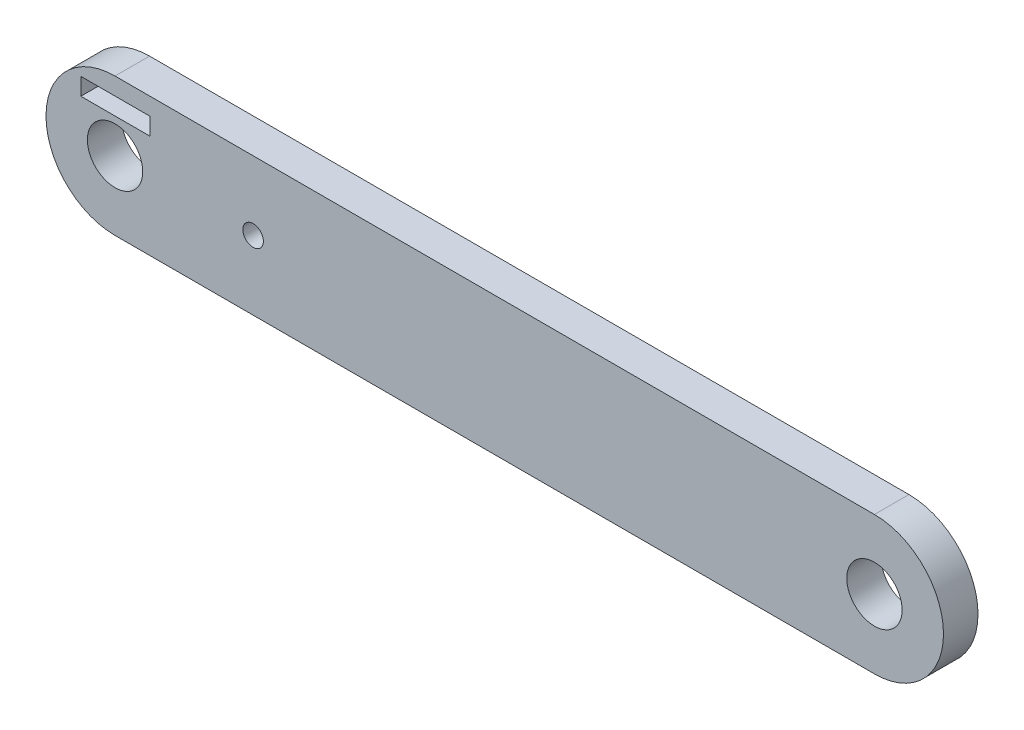
ISO-10303-21;
HEADER;
FILE_DESCRIPTION(('STEP AP214'),'2;1');
FILE_NAME('part.step','',(''),(''),'','','');
FILE_SCHEMA(('AUTOMOTIVE_DESIGN { 1 0 10303 214 1 1 1 1 }'));
ENDSEC;
DATA;
#1=APPLICATION_CONTEXT('core data for automotive mechanical design processes');
#2=APPLICATION_PROTOCOL_DEFINITION('international standard','automotive_design',2000,#1);
#3=PRODUCT_CONTEXT('',#1,'mechanical');
#4=PRODUCT('Part','Part','',(#3));
#5=PRODUCT_RELATED_PRODUCT_CATEGORY('part','',(#4));
#6=PRODUCT_DEFINITION_FORMATION('','',#4);
#7=PRODUCT_DEFINITION_CONTEXT('part definition',#1,'design');
#8=PRODUCT_DEFINITION('design','',#6,#7);
#9=PRODUCT_DEFINITION_SHAPE('','',#8);
#10=(LENGTH_UNIT() NAMED_UNIT(*) SI_UNIT(.MILLI.,.METRE.));
#11=(NAMED_UNIT(*) PLANE_ANGLE_UNIT() SI_UNIT($,.RADIAN.));
#12=(NAMED_UNIT(*) SI_UNIT($,.STERADIAN.) SOLID_ANGLE_UNIT());
#13=UNCERTAINTY_MEASURE_WITH_UNIT(LENGTH_MEASURE(1.E-05),#10,'distance_accuracy_value','');
#14=(GEOMETRIC_REPRESENTATION_CONTEXT(3) GLOBAL_UNCERTAINTY_ASSIGNED_CONTEXT((#13)) GLOBAL_UNIT_ASSIGNED_CONTEXT((#10,
#11,#12)) REPRESENTATION_CONTEXT('',''));
#15=CARTESIAN_POINT('',(0.,0.,0.));
#16=DIRECTION('',(0.,0.,1.));
#17=DIRECTION('',(1.,0.,0.));
#18=AXIS2_PLACEMENT_3D('',#15,#16,#17);
#19=CARTESIAN_POINT('',(0.,0.,5.));
#20=DIRECTION('',(0.,0.,-1.));
#21=DIRECTION('',(-1.,0.,0.));
#22=AXIS2_PLACEMENT_3D('',#19,#20,#21);
#23=CYLINDRICAL_SURFACE('',#22,10.);
#24=CARTESIAN_POINT('',(0.,0.,0.));
#25=DIRECTION('',(0.,0.,1.));
#26=DIRECTION('',(1.,0.,0.));
#27=AXIS2_PLACEMENT_3D('',#24,#25,#26);
#28=CIRCLE('',#27,10.);
#29=CARTESIAN_POINT('',(0.,10.,0.));
#30=VERTEX_POINT('',#29);
#31=CARTESIAN_POINT('',(0.,-10.,0.));
#32=VERTEX_POINT('',#31);
#33=EDGE_CURVE('E164',#30,#32,#28,.T.);
#34=ORIENTED_EDGE('',*,*,#33,.T.);
#35=DIRECTION('',(0.,0.,-1.));
#36=VECTOR('',#35,1.);
#37=CARTESIAN_POINT('',(0.,-10.,5.));
#38=LINE('',#37,#36);
#39=CARTESIAN_POINT('',(0.,-10.,5.));
#40=VERTEX_POINT('',#39);
#41=EDGE_CURVE('E11',#40,#32,#38,.T.);
#42=ORIENTED_EDGE('',*,*,#41,.F.);
#43=CARTESIAN_POINT('',(0.,0.,5.));
#44=DIRECTION('',(0.,0.,1.));
#45=DIRECTION('',(1.,0.,0.));
#46=AXIS2_PLACEMENT_3D('',#43,#44,#45);
#47=CIRCLE('',#46,10.);
#48=CARTESIAN_POINT('',(0.,10.,5.));
#49=VERTEX_POINT('',#48);
#50=EDGE_CURVE('E147',#49,#40,#47,.T.);
#51=ORIENTED_EDGE('',*,*,#50,.F.);
#52=DIRECTION('',(0.,0.,-1.));
#53=VECTOR('',#52,1.);
#54=CARTESIAN_POINT('',(0.,10.,5.));
#55=LINE('',#54,#53);
#56=EDGE_CURVE('E161',#49,#30,#55,.T.);
#57=ORIENTED_EDGE('',*,*,#56,.T.);
#58=EDGE_LOOP('',(#34,#42,#51,#57));
#59=FACE_BOUND('',#58,.T.);
#60=ADVANCED_FACE('F37',(#59),#23,.T.);
#61=CARTESIAN_POINT('',(0.,-10.,5.));
#62=DIRECTION('',(0.,1.,0.));
#63=DIRECTION('',(0.,0.,1.));
#64=AXIS2_PLACEMENT_3D('',#61,#62,#63);
#65=PLANE('',#64);
#66=DIRECTION('',(1.,0.,0.));
#67=VECTOR('',#66,1.);
#68=CARTESIAN_POINT('',(0.,-10.,0.));
#69=LINE('',#68,#67);
#70=CARTESIAN_POINT('',(110.,-10.0000000000639,0.));
#71=VERTEX_POINT('',#70);
#72=EDGE_CURVE('E167',#32,#71,#69,.T.);
#73=ORIENTED_EDGE('',*,*,#72,.T.);
#74=DIRECTION('',(0.,0.,-1.));
#75=VECTOR('',#74,1.);
#76=CARTESIAN_POINT('',(110.,-10.0000000000639,5.));
#77=LINE('',#76,#75);
#78=CARTESIAN_POINT('',(110.,-10.0000000000639,5.));
#79=VERTEX_POINT('',#78);
#80=EDGE_CURVE('E45',#79,#71,#77,.T.);
#81=ORIENTED_EDGE('',*,*,#80,.F.);
#82=DIRECTION('',(1.,0.,0.));
#83=VECTOR('',#82,1.);
#84=CARTESIAN_POINT('',(0.,-10.,5.));
#85=LINE('',#84,#83);
#86=EDGE_CURVE('E151',#40,#79,#85,.T.);
#87=ORIENTED_EDGE('',*,*,#86,.F.);
#88=ORIENTED_EDGE('',*,*,#41,.T.);
#89=EDGE_LOOP('',(#73,#81,#87,#88));
#90=FACE_BOUND('',#89,.T.);
#91=ADVANCED_FACE('F199',(#90),#65,.F.);
#92=CARTESIAN_POINT('',(110.,-6.38881308967498E-11,5.));
#93=DIRECTION('',(0.,0.,-1.));
#94=DIRECTION('',(-1.,0.,0.));
#95=AXIS2_PLACEMENT_3D('',#92,#93,#94);
#96=CYLINDRICAL_SURFACE('',#95,10.0000000000639);
#97=CARTESIAN_POINT('',(110.,-6.38881308967498E-11,0.));
#98=DIRECTION('',(0.,0.,1.));
#99=DIRECTION('',(1.,0.,0.));
#100=AXIS2_PLACEMENT_3D('',#97,#98,#99);
#101=CIRCLE('',#100,10.0000000000639);
#102=CARTESIAN_POINT('',(110.,10.,0.));
#103=VERTEX_POINT('',#102);
#104=EDGE_CURVE('E169',#71,#103,#101,.T.);
#105=ORIENTED_EDGE('',*,*,#104,.T.);
#106=DIRECTION('',(0.,0.,-1.));
#107=VECTOR('',#106,1.);
#108=CARTESIAN_POINT('',(110.,10.,5.));
#109=LINE('',#108,#107);
#110=CARTESIAN_POINT('',(110.,10.,5.));
#111=VERTEX_POINT('',#110);
#112=EDGE_CURVE('E178',#111,#103,#109,.T.);
#113=ORIENTED_EDGE('',*,*,#112,.F.);
#114=CARTESIAN_POINT('',(110.,-6.38881308967498E-11,5.));
#115=DIRECTION('',(0.,0.,1.));
#116=DIRECTION('',(1.,0.,0.));
#117=AXIS2_PLACEMENT_3D('',#114,#115,#116);
#118=CIRCLE('',#117,10.0000000000639);
#119=EDGE_CURVE('E153',#79,#111,#118,.T.);
#120=ORIENTED_EDGE('',*,*,#119,.F.);
#121=ORIENTED_EDGE('',*,*,#80,.T.);
#122=EDGE_LOOP('',(#105,#113,#120,#121));
#123=FACE_BOUND('',#122,.T.);
#124=ADVANCED_FACE('F184',(#123),#96,.T.);
#125=CARTESIAN_POINT('',(0.,10.,5.));
#126=DIRECTION('',(0.,1.,0.));
#127=DIRECTION('',(-1.,0.,0.));
#128=AXIS2_PLACEMENT_3D('',#125,#126,#127);
#129=PLANE('',#128);
#130=DIRECTION('',(1.,0.,0.));
#131=VECTOR('',#130,1.);
#132=CARTESIAN_POINT('',(0.,10.,0.));
#133=LINE('',#132,#131);
#134=EDGE_CURVE('E172',#30,#103,#133,.T.);
#135=ORIENTED_EDGE('',*,*,#134,.F.);
#136=ORIENTED_EDGE('',*,*,#56,.F.);
#137=DIRECTION('',(1.,0.,0.));
#138=VECTOR('',#137,1.);
#139=CARTESIAN_POINT('',(0.,10.,5.));
#140=LINE('',#139,#138);
#141=EDGE_CURVE('E155',#49,#111,#140,.T.);
#142=ORIENTED_EDGE('',*,*,#141,.T.);
#143=ORIENTED_EDGE('',*,*,#112,.T.);
#144=EDGE_LOOP('',(#135,#136,#142,#143));
#145=FACE_BOUND('',#144,.T.);
#146=ADVANCED_FACE('F192',(#145),#129,.T.);
#147=CARTESIAN_POINT('',(0.,0.,5.));
#148=DIRECTION('',(0.,0.,-1.));
#149=DIRECTION('',(-1.,0.,0.));
#150=AXIS2_PLACEMENT_3D('',#147,#148,#149);
#151=CYLINDRICAL_SURFACE('',#150,4.01);
#152=CARTESIAN_POINT('',(0.,0.,5.));
#153=DIRECTION('',(0.,0.,1.));
#154=DIRECTION('',(1.,0.,0.));
#155=AXIS2_PLACEMENT_3D('',#152,#153,#154);
#156=CIRCLE('',#155,4.01);
#157=CARTESIAN_POINT('',(4.01,0.,5.));
#158=VERTEX_POINT('',#157);
#159=EDGE_CURVE('E144',#158,#158,#156,.T.);
#160=ORIENTED_EDGE('',*,*,#159,.T.);
#161=EDGE_LOOP('',(#160));
#162=FACE_BOUND('',#161,.T.);
#163=CARTESIAN_POINT('',(0.,0.,0.));
#164=DIRECTION('',(0.,0.,1.));
#165=DIRECTION('',(1.,0.,0.));
#166=AXIS2_PLACEMENT_3D('',#163,#164,#165);
#167=CIRCLE('',#166,4.01);
#168=CARTESIAN_POINT('',(4.01,0.,0.));
#169=VERTEX_POINT('',#168);
#170=EDGE_CURVE('E141',#169,#169,#167,.T.);
#171=ORIENTED_EDGE('',*,*,#170,.F.);
#172=EDGE_LOOP('',(#171));
#173=FACE_BOUND('',#172,.T.);
#174=ADVANCED_FACE('F39',(#162,#173),#151,.F.);
#175=CARTESIAN_POINT('',(110.,-6.38881308967498E-11,5.));
#176=DIRECTION('',(0.,0.,-1.));
#177=DIRECTION('',(-1.,0.,0.));
#178=AXIS2_PLACEMENT_3D('',#175,#176,#177);
#179=CYLINDRICAL_SURFACE('',#178,4.01);
#180=CARTESIAN_POINT('',(110.,-6.38881308967498E-11,5.));
#181=DIRECTION('',(0.,0.,1.));
#182=DIRECTION('',(1.,0.,0.));
#183=AXIS2_PLACEMENT_3D('',#180,#181,#182);
#184=CIRCLE('',#183,4.01);
#185=CARTESIAN_POINT('',(114.01,-6.38881308967498E-11,5.));
#186=VERTEX_POINT('',#185);
#187=EDGE_CURVE('E158',#186,#186,#184,.T.);
#188=ORIENTED_EDGE('',*,*,#187,.T.);
#189=EDGE_LOOP('',(#188));
#190=FACE_BOUND('',#189,.T.);
#191=CARTESIAN_POINT('',(110.,-6.38881308967498E-11,0.));
#192=DIRECTION('',(0.,0.,1.));
#193=DIRECTION('',(1.,0.,0.));
#194=AXIS2_PLACEMENT_3D('',#191,#192,#193);
#195=CIRCLE('',#194,4.01);
#196=CARTESIAN_POINT('',(114.01,-6.38881308967498E-11,0.));
#197=VERTEX_POINT('',#196);
#198=EDGE_CURVE('E148',#197,#197,#195,.T.);
#199=ORIENTED_EDGE('',*,*,#198,.F.);
#200=EDGE_LOOP('',(#199));
#201=FACE_BOUND('',#200,.T.);
#202=ADVANCED_FACE('F211',(#190,#201),#179,.F.);
#203=CARTESIAN_POINT('',(0.,0.,5.));
#204=DIRECTION('',(0.,0.,1.));
#205=DIRECTION('',(1.,0.,0.));
#206=AXIS2_PLACEMENT_3D('',#203,#204,#205);
#207=PLANE('',#206);
#208=DIRECTION('',(0.,-1.,0.));
#209=VECTOR('',#208,1.);
#210=CARTESIAN_POINT('',(-4.9531105439371,0.,5.));
#211=LINE('',#210,#209);
#212=CARTESIAN_POINT('',(-4.9531105439371,7.48516197188792,5.));
#213=VERTEX_POINT('',#212);
#214=CARTESIAN_POINT('',(-4.9531105439371,4.98516197188792,5.));
#215=VERTEX_POINT('',#214);
#216=EDGE_CURVE('E135',#213,#215,#211,.T.);
#217=ORIENTED_EDGE('',*,*,#216,.F.);
#218=DIRECTION('',(-1.,0.,0.));
#219=VECTOR('',#218,1.);
#220=CARTESIAN_POINT('',(0.,7.48516197188792,5.));
#221=LINE('',#220,#219);
#222=CARTESIAN_POINT('',(5.0468894560629,7.48516197188792,5.));
#223=VERTEX_POINT('',#222);
#224=EDGE_CURVE('E128',#223,#213,#221,.T.);
#225=ORIENTED_EDGE('',*,*,#224,.F.);
#226=DIRECTION('',(0.,1.,0.));
#227=VECTOR('',#226,1.);
#228=CARTESIAN_POINT('',(5.0468894560629,0.,5.));
#229=LINE('',#228,#227);
#230=CARTESIAN_POINT('',(5.0468894560629,4.98516197188792,5.));
#231=VERTEX_POINT('',#230);
#232=EDGE_CURVE('E108',#231,#223,#229,.T.);
#233=ORIENTED_EDGE('',*,*,#232,.F.);
#234=DIRECTION('',(1.,0.,0.));
#235=VECTOR('',#234,1.);
#236=CARTESIAN_POINT('',(0.,4.98516197188792,5.));
#237=LINE('',#236,#235);
#238=EDGE_CURVE('E133',#215,#231,#237,.T.);
#239=ORIENTED_EDGE('',*,*,#238,.F.);
#240=EDGE_LOOP('',(#217,#225,#233,#239));
#241=FACE_BOUND('',#240,.T.);
#242=CARTESIAN_POINT('',(20.,0.,5.));
#243=DIRECTION('',(0.,0.,1.));
#244=DIRECTION('',(1.,0.,0.));
#245=AXIS2_PLACEMENT_3D('',#242,#243,#244);
#246=CIRCLE('',#245,1.49);
#247=CARTESIAN_POINT('',(21.49,0.,5.));
#248=VERTEX_POINT('',#247);
#249=EDGE_CURVE('E137',#248,#248,#246,.F.);
#250=ORIENTED_EDGE('',*,*,#249,.T.);
#251=EDGE_LOOP('',(#250));
#252=FACE_BOUND('',#251,.T.);
#253=ORIENTED_EDGE('',*,*,#159,.F.);
#254=EDGE_LOOP('',(#253));
#255=FACE_BOUND('',#254,.T.);
#256=ORIENTED_EDGE('',*,*,#50,.T.);
#257=ORIENTED_EDGE('',*,*,#86,.T.);
#258=ORIENTED_EDGE('',*,*,#119,.T.);
#259=ORIENTED_EDGE('',*,*,#141,.F.);
#260=EDGE_LOOP('',(#256,#257,#258,#259));
#261=FACE_BOUND('',#260,.T.);
#262=ORIENTED_EDGE('',*,*,#187,.F.);
#263=EDGE_LOOP('',(#262));
#264=FACE_BOUND('',#263,.T.);
#265=ADVANCED_FACE('F196',(#241,#252,#255,#261,#264),#207,.T.);
#266=CARTESIAN_POINT('',(0.,0.,0.));
#267=DIRECTION('',(0.,0.,1.));
#268=DIRECTION('',(1.,0.,0.));
#269=AXIS2_PLACEMENT_3D('',#266,#267,#268);
#270=PLANE('',#269);
#271=DIRECTION('',(1.,0.,0.));
#272=VECTOR('',#271,1.);
#273=CARTESIAN_POINT('',(5.0468894560629,7.48516197188792,0.));
#274=LINE('',#273,#272);
#275=CARTESIAN_POINT('',(-4.9531105439371,7.48516197188792,0.));
#276=VERTEX_POINT('',#275);
#277=CARTESIAN_POINT('',(5.0468894560629,7.48516197188792,0.));
#278=VERTEX_POINT('',#277);
#279=EDGE_CURVE('E114',#276,#278,#274,.T.);
#280=ORIENTED_EDGE('',*,*,#279,.F.);
#281=DIRECTION('',(0.,1.,0.));
#282=VECTOR('',#281,1.);
#283=CARTESIAN_POINT('',(-4.9531105439371,4.98516197188792,0.));
#284=LINE('',#283,#282);
#285=CARTESIAN_POINT('',(-4.9531105439371,4.98516197188792,0.));
#286=VERTEX_POINT('',#285);
#287=EDGE_CURVE('E60',#286,#276,#284,.T.);
#288=ORIENTED_EDGE('',*,*,#287,.F.);
#289=DIRECTION('',(-1.,0.,0.));
#290=VECTOR('',#289,1.);
#291=CARTESIAN_POINT('',(-4.9531105439371,4.98516197188792,0.));
#292=LINE('',#291,#290);
#293=CARTESIAN_POINT('',(5.0468894560629,4.98516197188792,0.));
#294=VERTEX_POINT('',#293);
#295=EDGE_CURVE('E121',#294,#286,#292,.T.);
#296=ORIENTED_EDGE('',*,*,#295,.F.);
#297=DIRECTION('',(0.,-1.,0.));
#298=VECTOR('',#297,1.);
#299=CARTESIAN_POINT('',(5.0468894560629,4.98516197188792,0.));
#300=LINE('',#299,#298);
#301=EDGE_CURVE('E105',#278,#294,#300,.T.);
#302=ORIENTED_EDGE('',*,*,#301,.F.);
#303=EDGE_LOOP('',(#280,#288,#296,#302));
#304=FACE_BOUND('',#303,.T.);
#305=CARTESIAN_POINT('',(20.,0.,0.));
#306=DIRECTION('',(0.,0.,-1.));
#307=DIRECTION('',(-1.,0.,0.));
#308=AXIS2_PLACEMENT_3D('',#305,#306,#307);
#309=CIRCLE('',#308,1.49);
#310=CARTESIAN_POINT('',(18.51,0.,0.));
#311=VERTEX_POINT('',#310);
#312=EDGE_CURVE('E138',#311,#311,#309,.T.);
#313=ORIENTED_EDGE('',*,*,#312,.F.);
#314=EDGE_LOOP('',(#313));
#315=FACE_BOUND('',#314,.T.);
#316=ORIENTED_EDGE('',*,*,#170,.T.);
#317=EDGE_LOOP('',(#316));
#318=FACE_BOUND('',#317,.T.);
#319=ORIENTED_EDGE('',*,*,#33,.F.);
#320=ORIENTED_EDGE('',*,*,#134,.T.);
#321=ORIENTED_EDGE('',*,*,#104,.F.);
#322=ORIENTED_EDGE('',*,*,#72,.F.);
#323=EDGE_LOOP('',(#319,#320,#321,#322));
#324=FACE_BOUND('',#323,.T.);
#325=ORIENTED_EDGE('',*,*,#198,.T.);
#326=EDGE_LOOP('',(#325));
#327=FACE_BOUND('',#326,.T.);
#328=ADVANCED_FACE('F118',(#304,#315,#318,#324,#327),#270,.F.);
#329=CARTESIAN_POINT('',(20.,0.,5.001));
#330=DIRECTION('',(0.,0.,-1.));
#331=DIRECTION('',(-1.,0.,0.));
#332=AXIS2_PLACEMENT_3D('',#329,#330,#331);
#333=CYLINDRICAL_SURFACE('',#332,1.49);
#334=ORIENTED_EDGE('',*,*,#249,.F.);
#335=EDGE_LOOP('',(#334));
#336=FACE_BOUND('',#335,.T.);
#337=ORIENTED_EDGE('',*,*,#312,.T.);
#338=EDGE_LOOP('',(#337));
#339=FACE_BOUND('',#338,.T.);
#340=ADVANCED_FACE('F217',(#336,#339),#333,.F.);
#341=CARTESIAN_POINT('',(-4.9531105439371,4.98516197188792,10.));
#342=DIRECTION('',(-1.,0.,0.));
#343=DIRECTION('',(0.,0.,1.));
#344=AXIS2_PLACEMENT_3D('',#341,#342,#343);
#345=PLANE('',#344);
#346=ORIENTED_EDGE('',*,*,#216,.T.);
#347=DIRECTION('',(0.,0.,-1.));
#348=VECTOR('',#347,1.);
#349=CARTESIAN_POINT('',(-4.9531105439371,4.98516197188792,10.));
#350=LINE('',#349,#348);
#351=EDGE_CURVE('E126',#215,#286,#350,.T.);
#352=ORIENTED_EDGE('',*,*,#351,.T.);
#353=ORIENTED_EDGE('',*,*,#287,.T.);
#354=DIRECTION('',(0.,0.,-1.));
#355=VECTOR('',#354,1.);
#356=CARTESIAN_POINT('',(-4.9531105439371,7.48516197188792,10.));
#357=LINE('',#356,#355);
#358=EDGE_CURVE('E111',#213,#276,#357,.T.);
#359=ORIENTED_EDGE('',*,*,#358,.F.);
#360=EDGE_LOOP('',(#346,#352,#353,#359));
#361=FACE_BOUND('',#360,.T.);
#362=ADVANCED_FACE('F223',(#361),#345,.F.);
#363=CARTESIAN_POINT('',(-4.9531105439371,4.98516197188792,10.));
#364=DIRECTION('',(0.,-1.,0.));
#365=DIRECTION('',(1.,0.,0.));
#366=AXIS2_PLACEMENT_3D('',#363,#364,#365);
#367=PLANE('',#366);
#368=ORIENTED_EDGE('',*,*,#238,.T.);
#369=DIRECTION('',(0.,0.,-1.));
#370=VECTOR('',#369,1.);
#371=CARTESIAN_POINT('',(5.0468894560629,4.98516197188792,10.));
#372=LINE('',#371,#370);
#373=EDGE_CURVE('E110',#231,#294,#372,.T.);
#374=ORIENTED_EDGE('',*,*,#373,.T.);
#375=ORIENTED_EDGE('',*,*,#295,.T.);
#376=ORIENTED_EDGE('',*,*,#351,.F.);
#377=EDGE_LOOP('',(#368,#374,#375,#376));
#378=FACE_BOUND('',#377,.T.);
#379=ADVANCED_FACE('F227',(#378),#367,.F.);
#380=CARTESIAN_POINT('',(5.0468894560629,4.98516197188792,10.));
#381=DIRECTION('',(1.,0.,0.));
#382=DIRECTION('',(0.,0.,-1.));
#383=AXIS2_PLACEMENT_3D('',#380,#381,#382);
#384=PLANE('',#383);
#385=ORIENTED_EDGE('',*,*,#232,.T.);
#386=DIRECTION('',(0.,0.,-1.));
#387=VECTOR('',#386,1.);
#388=CARTESIAN_POINT('',(5.0468894560629,7.48516197188792,10.));
#389=LINE('',#388,#387);
#390=EDGE_CURVE('E52',#223,#278,#389,.T.);
#391=ORIENTED_EDGE('',*,*,#390,.T.);
#392=ORIENTED_EDGE('',*,*,#301,.T.);
#393=ORIENTED_EDGE('',*,*,#373,.F.);
#394=EDGE_LOOP('',(#385,#391,#392,#393));
#395=FACE_BOUND('',#394,.T.);
#396=ADVANCED_FACE('F102',(#395),#384,.F.);
#397=CARTESIAN_POINT('',(5.0468894560629,7.48516197188792,10.));
#398=DIRECTION('',(0.,1.,0.));
#399=DIRECTION('',(0.,0.,1.));
#400=AXIS2_PLACEMENT_3D('',#397,#398,#399);
#401=PLANE('',#400);
#402=ORIENTED_EDGE('',*,*,#224,.T.);
#403=ORIENTED_EDGE('',*,*,#358,.T.);
#404=ORIENTED_EDGE('',*,*,#279,.T.);
#405=ORIENTED_EDGE('',*,*,#390,.F.);
#406=EDGE_LOOP('',(#402,#403,#404,#405));
#407=FACE_BOUND('',#406,.T.);
#408=ADVANCED_FACE('F115',(#407),#401,.F.);
#409=CLOSED_SHELL('',(#60,#91,#124,#146,#174,#202,#265,#328,#340,#362,#379,#396,#408));
#410=MANIFOLD_SOLID_BREP('B2',#409);
#411=ADVANCED_BREP_SHAPE_REPRESENTATION('',(#18,#410),#14);
#412=SHAPE_DEFINITION_REPRESENTATION(#9,#411);
ENDSEC;
END-ISO-10303-21;
